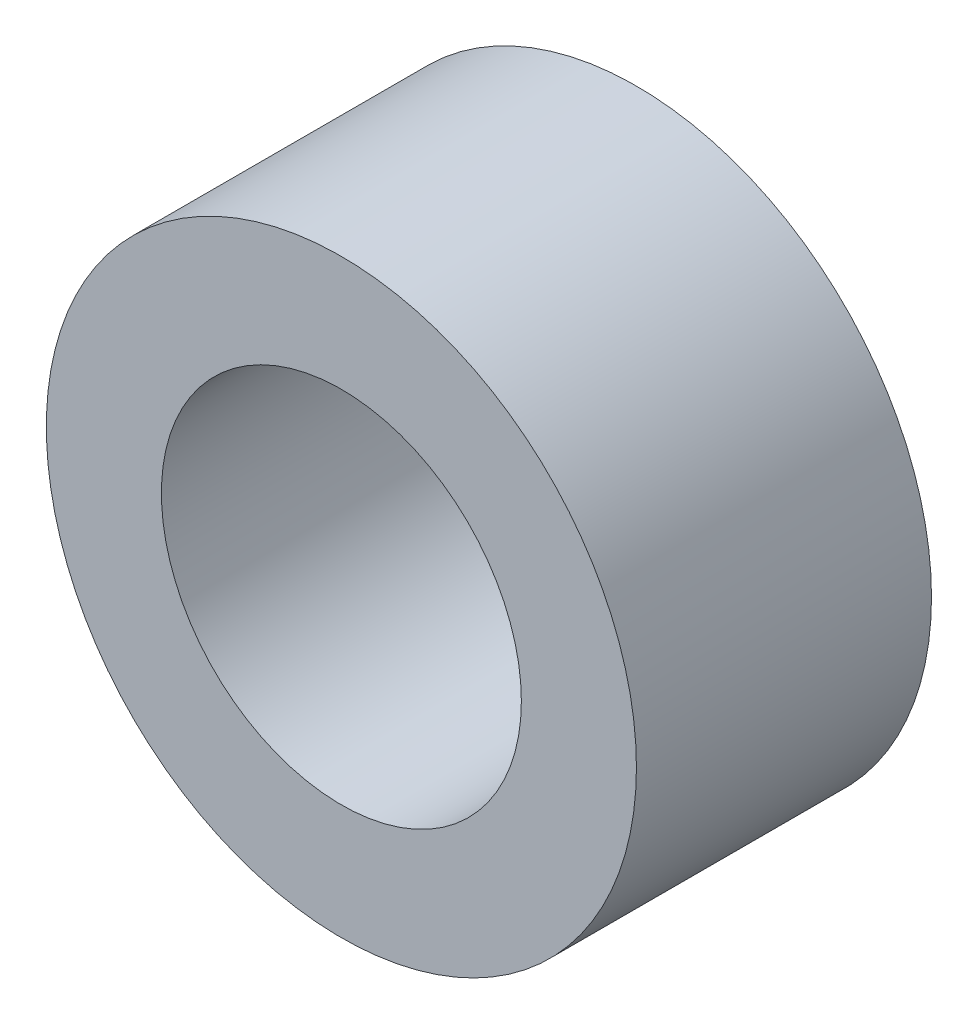
ISO-10303-21;
HEADER;
FILE_DESCRIPTION(('STEP AP214'),'2;1');
FILE_NAME('part.step','',(''),(''),'','','');
FILE_SCHEMA(('AUTOMOTIVE_DESIGN { 1 0 10303 214 1 1 1 1 }'));
ENDSEC;
DATA;
#1=APPLICATION_CONTEXT('core data for automotive mechanical design processes');
#2=APPLICATION_PROTOCOL_DEFINITION('international standard','automotive_design',2000,#1);
#3=PRODUCT_CONTEXT('',#1,'mechanical');
#4=PRODUCT('Part','Part','',(#3));
#5=PRODUCT_RELATED_PRODUCT_CATEGORY('part','',(#4));
#6=PRODUCT_DEFINITION_FORMATION('','',#4);
#7=PRODUCT_DEFINITION_CONTEXT('part definition',#1,'design');
#8=PRODUCT_DEFINITION('design','',#6,#7);
#9=PRODUCT_DEFINITION_SHAPE('','',#8);
#10=(LENGTH_UNIT() NAMED_UNIT(*) SI_UNIT(.MILLI.,.METRE.));
#11=(NAMED_UNIT(*) PLANE_ANGLE_UNIT() SI_UNIT($,.RADIAN.));
#12=(NAMED_UNIT(*) SI_UNIT($,.STERADIAN.) SOLID_ANGLE_UNIT());
#13=UNCERTAINTY_MEASURE_WITH_UNIT(LENGTH_MEASURE(1.E-05),#10,'distance_accuracy_value','');
#14=(GEOMETRIC_REPRESENTATION_CONTEXT(3) GLOBAL_UNCERTAINTY_ASSIGNED_CONTEXT((#13)) GLOBAL_UNIT_ASSIGNED_CONTEXT((#10,
#11,#12)) REPRESENTATION_CONTEXT('',''));
#15=CARTESIAN_POINT('',(0.,0.,0.));
#16=DIRECTION('',(0.,0.,1.));
#17=DIRECTION('',(1.,0.,0.));
#18=AXIS2_PLACEMENT_3D('',#15,#16,#17);
#19=CARTESIAN_POINT('',(0.,0.,5.));
#20=DIRECTION('',(0.,0.,1.));
#21=DIRECTION('',(1.,0.,0.));
#22=AXIS2_PLACEMENT_3D('',#19,#20,#21);
#23=PLANE('',#22);
#24=CARTESIAN_POINT('',(0.,0.,5.));
#25=DIRECTION('',(0.,0.,1.));
#26=DIRECTION('',(1.,0.,0.));
#27=AXIS2_PLACEMENT_3D('',#24,#25,#26);
#28=CIRCLE('',#27,5.);
#29=CARTESIAN_POINT('',(5.,0.,5.));
#30=VERTEX_POINT('',#29);
#31=EDGE_CURVE('E10',#30,#30,#28,.T.);
#32=ORIENTED_EDGE('',*,*,#31,.T.);
#33=EDGE_LOOP('',(#32));
#34=FACE_BOUND('',#33,.T.);
#35=CARTESIAN_POINT('',(0.,0.,5.));
#36=DIRECTION('',(0.,0.,1.));
#37=DIRECTION('',(1.,0.,0.));
#38=AXIS2_PLACEMENT_3D('',#35,#36,#37);
#39=CIRCLE('',#38,3.05);
#40=CARTESIAN_POINT('',(3.05,0.,5.));
#41=VERTEX_POINT('',#40);
#42=EDGE_CURVE('E45',#41,#41,#39,.T.);
#43=ORIENTED_EDGE('',*,*,#42,.F.);
#44=EDGE_LOOP('',(#43));
#45=FACE_BOUND('',#44,.T.);
#46=ADVANCED_FACE('F34',(#34,#45),#23,.T.);
#47=CARTESIAN_POINT('',(0.,0.,0.));
#48=DIRECTION('',(0.,0.,1.));
#49=DIRECTION('',(1.,0.,0.));
#50=AXIS2_PLACEMENT_3D('',#47,#48,#49);
#51=PLANE('',#50);
#52=CARTESIAN_POINT('',(0.,0.,0.));
#53=DIRECTION('',(0.,0.,1.));
#54=DIRECTION('',(1.,0.,0.));
#55=AXIS2_PLACEMENT_3D('',#52,#53,#54);
#56=CIRCLE('',#55,5.);
#57=CARTESIAN_POINT('',(5.,0.,0.));
#58=VERTEX_POINT('',#57);
#59=EDGE_CURVE('E38',#58,#58,#56,.T.);
#60=ORIENTED_EDGE('',*,*,#59,.F.);
#61=EDGE_LOOP('',(#60));
#62=FACE_BOUND('',#61,.T.);
#63=CARTESIAN_POINT('',(0.,0.,0.));
#64=DIRECTION('',(0.,0.,1.));
#65=DIRECTION('',(1.,0.,0.));
#66=AXIS2_PLACEMENT_3D('',#63,#64,#65);
#67=CIRCLE('',#66,3.05);
#68=CARTESIAN_POINT('',(3.05,0.,0.));
#69=VERTEX_POINT('',#68);
#70=EDGE_CURVE('E47',#69,#69,#67,.T.);
#71=ORIENTED_EDGE('',*,*,#70,.T.);
#72=EDGE_LOOP('',(#71));
#73=FACE_BOUND('',#72,.T.);
#74=ADVANCED_FACE('F57',(#62,#73),#51,.F.);
#75=CARTESIAN_POINT('',(0.,0.,5.));
#76=DIRECTION('',(0.,0.,-1.));
#77=DIRECTION('',(-1.,0.,0.));
#78=AXIS2_PLACEMENT_3D('',#75,#76,#77);
#79=CYLINDRICAL_SURFACE('',#78,5.);
#80=ORIENTED_EDGE('',*,*,#31,.F.);
#81=EDGE_LOOP('',(#80));
#82=FACE_BOUND('',#81,.T.);
#83=ORIENTED_EDGE('',*,*,#59,.T.);
#84=EDGE_LOOP('',(#83));
#85=FACE_BOUND('',#84,.T.);
#86=ADVANCED_FACE('F36',(#82,#85),#79,.T.);
#87=CARTESIAN_POINT('',(0.,0.,5.));
#88=DIRECTION('',(0.,0.,-1.));
#89=DIRECTION('',(-1.,0.,0.));
#90=AXIS2_PLACEMENT_3D('',#87,#88,#89);
#91=CYLINDRICAL_SURFACE('',#90,3.05);
#92=ORIENTED_EDGE('',*,*,#42,.T.);
#93=EDGE_LOOP('',(#92));
#94=FACE_BOUND('',#93,.T.);
#95=ORIENTED_EDGE('',*,*,#70,.F.);
#96=EDGE_LOOP('',(#95));
#97=FACE_BOUND('',#96,.T.);
#98=ADVANCED_FACE('F53',(#94,#97),#91,.F.);
#99=CLOSED_SHELL('',(#46,#74,#86,#98));
#100=MANIFOLD_SOLID_BREP('B2',#99);
#101=ADVANCED_BREP_SHAPE_REPRESENTATION('',(#18,#100),#14);
#102=SHAPE_DEFINITION_REPRESENTATION(#9,#101);
ENDSEC;
END-ISO-10303-21;
